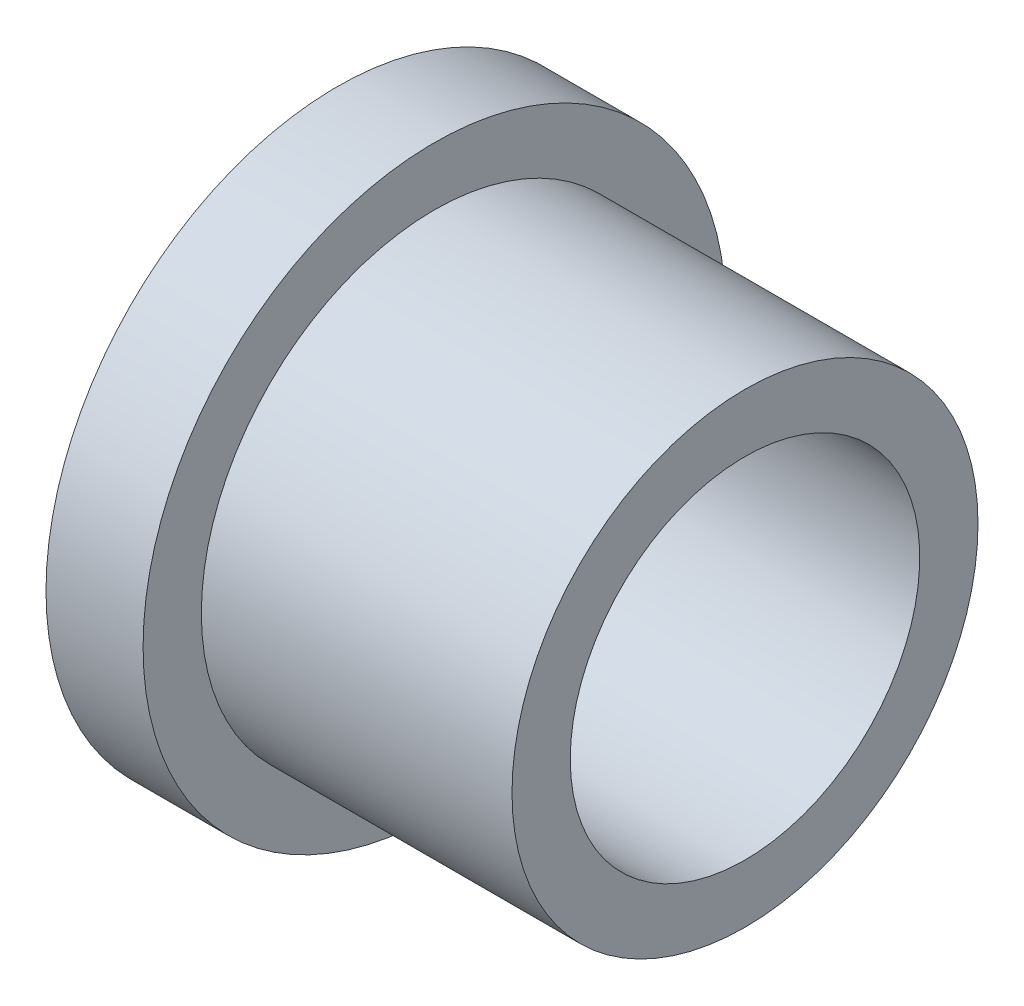
ISO-10303-21;
HEADER;
FILE_DESCRIPTION(('STEP AP214'),'2;1');
FILE_NAME('part.step','',(''),(''),'','','');
FILE_SCHEMA(('AUTOMOTIVE_DESIGN { 1 0 10303 214 1 1 1 1 }'));
ENDSEC;
DATA;
#1=APPLICATION_CONTEXT('core data for automotive mechanical design processes');
#2=APPLICATION_PROTOCOL_DEFINITION('international standard','automotive_design',2000,#1);
#3=PRODUCT_CONTEXT('',#1,'mechanical');
#4=PRODUCT('Part','Part','',(#3));
#5=PRODUCT_RELATED_PRODUCT_CATEGORY('part','',(#4));
#6=PRODUCT_DEFINITION_FORMATION('','',#4);
#7=PRODUCT_DEFINITION_CONTEXT('part definition',#1,'design');
#8=PRODUCT_DEFINITION('design','',#6,#7);
#9=PRODUCT_DEFINITION_SHAPE('','',#8);
#10=(LENGTH_UNIT() NAMED_UNIT(*) SI_UNIT(.MILLI.,.METRE.));
#11=(NAMED_UNIT(*) PLANE_ANGLE_UNIT() SI_UNIT($,.RADIAN.));
#12=(NAMED_UNIT(*) SI_UNIT($,.STERADIAN.) SOLID_ANGLE_UNIT());
#13=UNCERTAINTY_MEASURE_WITH_UNIT(LENGTH_MEASURE(1.E-05),#10,'distance_accuracy_value','');
#14=(GEOMETRIC_REPRESENTATION_CONTEXT(3) GLOBAL_UNCERTAINTY_ASSIGNED_CONTEXT((#13)) GLOBAL_UNIT_ASSIGNED_CONTEXT((#10,
#11,#12)) REPRESENTATION_CONTEXT('',''));
#15=CARTESIAN_POINT('',(0.,0.,0.));
#16=DIRECTION('',(0.,0.,1.));
#17=DIRECTION('',(1.,0.,0.));
#18=AXIS2_PLACEMENT_3D('',#15,#16,#17);
#19=CARTESIAN_POINT('',(0.,0.,0.));
#20=DIRECTION('',(-1.,0.,0.));
#21=DIRECTION('',(0.,0.,1.));
#22=AXIS2_PLACEMENT_3D('',#19,#20,#21);
#23=CYLINDRICAL_SURFACE('',#22,9.);
#24=CARTESIAN_POINT('',(0.,0.,0.));
#25=DIRECTION('',(-1.,0.,0.));
#26=DIRECTION('',(0.,0.,1.));
#27=AXIS2_PLACEMENT_3D('',#24,#25,#26);
#28=CIRCLE('',#27,9.);
#29=CARTESIAN_POINT('',(0.,0.,9.));
#30=VERTEX_POINT('',#29);
#31=EDGE_CURVE('E55',#30,#30,#28,.T.);
#32=ORIENTED_EDGE('',*,*,#31,.T.);
#33=EDGE_LOOP('',(#32));
#34=FACE_BOUND('',#33,.T.);
#35=CARTESIAN_POINT('',(21.,0.,0.));
#36=DIRECTION('',(-1.,0.,0.));
#37=DIRECTION('',(0.,0.,1.));
#38=AXIS2_PLACEMENT_3D('',#35,#36,#37);
#39=CIRCLE('',#38,9.);
#40=CARTESIAN_POINT('',(21.,0.,9.));
#41=VERTEX_POINT('',#40);
#42=EDGE_CURVE('E10',#41,#41,#39,.T.);
#43=ORIENTED_EDGE('',*,*,#42,.F.);
#44=EDGE_LOOP('',(#43));
#45=FACE_BOUND('',#44,.T.);
#46=ADVANCED_FACE('F33',(#34,#45),#23,.F.);
#47=CARTESIAN_POINT('',(21.,0.,0.));
#48=DIRECTION('',(1.,0.,0.));
#49=DIRECTION('',(0.,0.,-1.));
#50=AXIS2_PLACEMENT_3D('',#47,#48,#49);
#51=PLANE('',#50);
#52=ORIENTED_EDGE('',*,*,#42,.T.);
#53=EDGE_LOOP('',(#52));
#54=FACE_BOUND('',#53,.T.);
#55=CARTESIAN_POINT('',(21.,0.,0.));
#56=DIRECTION('',(-1.,0.,0.));
#57=DIRECTION('',(0.,0.,1.));
#58=AXIS2_PLACEMENT_3D('',#55,#56,#57);
#59=CIRCLE('',#58,12.);
#60=CARTESIAN_POINT('',(21.,0.,12.));
#61=VERTEX_POINT('',#60);
#62=EDGE_CURVE('E39',#61,#61,#59,.T.);
#63=ORIENTED_EDGE('',*,*,#62,.F.);
#64=EDGE_LOOP('',(#63));
#65=FACE_BOUND('',#64,.T.);
#66=ADVANCED_FACE('F73',(#54,#65),#51,.T.);
#67=CARTESIAN_POINT('',(0.,0.,0.));
#68=DIRECTION('',(-1.,0.,0.));
#69=DIRECTION('',(0.,0.,1.));
#70=AXIS2_PLACEMENT_3D('',#67,#68,#69);
#71=CYLINDRICAL_SURFACE('',#70,12.);
#72=ORIENTED_EDGE('',*,*,#62,.T.);
#73=EDGE_LOOP('',(#72));
#74=FACE_BOUND('',#73,.T.);
#75=CARTESIAN_POINT('',(5.,0.,0.));
#76=DIRECTION('',(-1.,0.,0.));
#77=DIRECTION('',(0.,0.,1.));
#78=AXIS2_PLACEMENT_3D('',#75,#76,#77);
#79=CIRCLE('',#78,12.);
#80=CARTESIAN_POINT('',(5.,0.,12.));
#81=VERTEX_POINT('',#80);
#82=EDGE_CURVE('E43',#81,#81,#79,.T.);
#83=ORIENTED_EDGE('',*,*,#82,.F.);
#84=EDGE_LOOP('',(#83));
#85=FACE_BOUND('',#84,.T.);
#86=ADVANCED_FACE('F77',(#74,#85),#71,.T.);
#87=CARTESIAN_POINT('',(5.,0.,0.));
#88=DIRECTION('',(1.,0.,0.));
#89=DIRECTION('',(0.,0.,-1.));
#90=AXIS2_PLACEMENT_3D('',#87,#88,#89);
#91=PLANE('',#90);
#92=ORIENTED_EDGE('',*,*,#82,.T.);
#93=EDGE_LOOP('',(#92));
#94=FACE_BOUND('',#93,.T.);
#95=CARTESIAN_POINT('',(5.,0.,0.));
#96=DIRECTION('',(-1.,0.,0.));
#97=DIRECTION('',(0.,0.,1.));
#98=AXIS2_PLACEMENT_3D('',#95,#96,#97);
#99=CIRCLE('',#98,15.);
#100=CARTESIAN_POINT('',(5.,0.,15.));
#101=VERTEX_POINT('',#100);
#102=EDGE_CURVE('E47',#101,#101,#99,.T.);
#103=ORIENTED_EDGE('',*,*,#102,.F.);
#104=EDGE_LOOP('',(#103));
#105=FACE_BOUND('',#104,.T.);
#106=ADVANCED_FACE('F69',(#94,#105),#91,.T.);
#107=CARTESIAN_POINT('',(0.,0.,0.));
#108=DIRECTION('',(-1.,0.,0.));
#109=DIRECTION('',(0.,0.,1.));
#110=AXIS2_PLACEMENT_3D('',#107,#108,#109);
#111=CYLINDRICAL_SURFACE('',#110,15.);
#112=ORIENTED_EDGE('',*,*,#102,.T.);
#113=EDGE_LOOP('',(#112));
#114=FACE_BOUND('',#113,.T.);
#115=CARTESIAN_POINT('',(0.,0.,0.));
#116=DIRECTION('',(-1.,0.,0.));
#117=DIRECTION('',(0.,0.,1.));
#118=AXIS2_PLACEMENT_3D('',#115,#116,#117);
#119=CIRCLE('',#118,15.);
#120=CARTESIAN_POINT('',(0.,0.,15.));
#121=VERTEX_POINT('',#120);
#122=EDGE_CURVE('E52',#121,#121,#119,.T.);
#123=ORIENTED_EDGE('',*,*,#122,.F.);
#124=EDGE_LOOP('',(#123));
#125=FACE_BOUND('',#124,.T.);
#126=ADVANCED_FACE('F63',(#114,#125),#111,.T.);
#127=CARTESIAN_POINT('',(0.,0.,0.));
#128=DIRECTION('',(-1.,0.,0.));
#129=DIRECTION('',(0.,0.,1.));
#130=AXIS2_PLACEMENT_3D('',#127,#128,#129);
#131=PLANE('',#130);
#132=ORIENTED_EDGE('',*,*,#122,.T.);
#133=EDGE_LOOP('',(#132));
#134=FACE_BOUND('',#133,.T.);
#135=ORIENTED_EDGE('',*,*,#31,.F.);
#136=EDGE_LOOP('',(#135));
#137=FACE_BOUND('',#136,.T.);
#138=ADVANCED_FACE('F61',(#134,#137),#131,.T.);
#139=CLOSED_SHELL('',(#46,#66,#86,#106,#126,#138));
#140=MANIFOLD_SOLID_BREP('B2',#139);
#141=ADVANCED_BREP_SHAPE_REPRESENTATION('',(#18,#140),#14);
#142=SHAPE_DEFINITION_REPRESENTATION(#9,#141);
ENDSEC;
END-ISO-10303-21;
